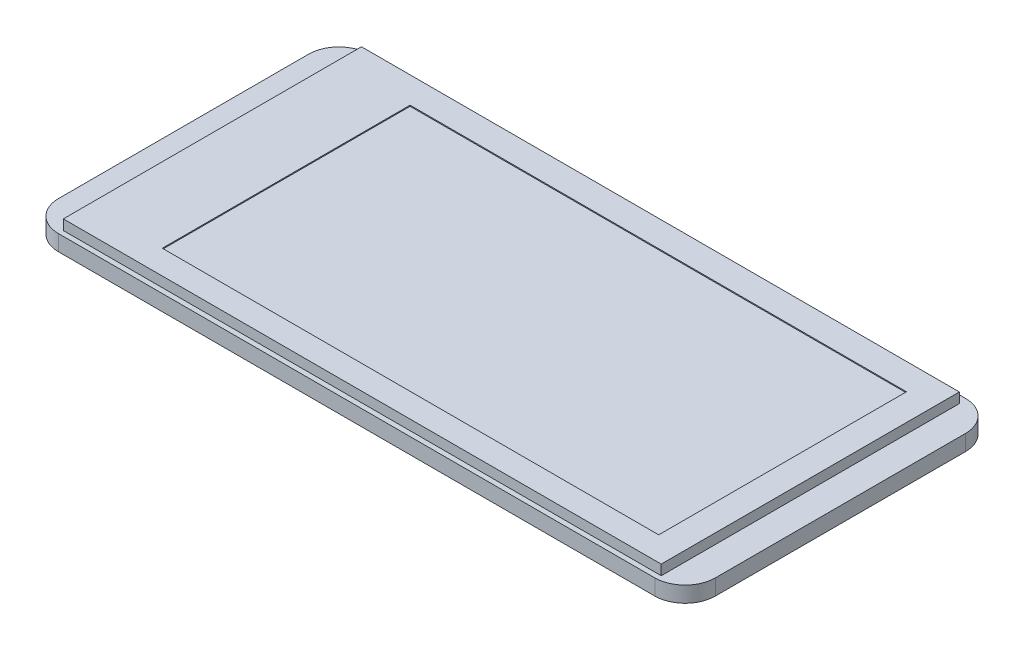
ISO-10303-21;
HEADER;
FILE_DESCRIPTION(('STEP AP214'),'2;1');
FILE_NAME('part.step','',(''),(''),'','','');
FILE_SCHEMA(('AUTOMOTIVE_DESIGN { 1 0 10303 214 1 1 1 1 }'));
ENDSEC;
DATA;
#1=APPLICATION_CONTEXT('core data for automotive mechanical design processes');
#2=APPLICATION_PROTOCOL_DEFINITION('international standard','automotive_design',2000,#1);
#3=PRODUCT_CONTEXT('',#1,'mechanical');
#4=PRODUCT('Part','Part','',(#3));
#5=PRODUCT_RELATED_PRODUCT_CATEGORY('part','',(#4));
#6=PRODUCT_DEFINITION_FORMATION('','',#4);
#7=PRODUCT_DEFINITION_CONTEXT('part definition',#1,'design');
#8=PRODUCT_DEFINITION('design','',#6,#7);
#9=PRODUCT_DEFINITION_SHAPE('','',#8);
#10=(LENGTH_UNIT() NAMED_UNIT(*) SI_UNIT(.MILLI.,.METRE.));
#11=(NAMED_UNIT(*) PLANE_ANGLE_UNIT() SI_UNIT($,.RADIAN.));
#12=(NAMED_UNIT(*) SI_UNIT($,.STERADIAN.) SOLID_ANGLE_UNIT());
#13=UNCERTAINTY_MEASURE_WITH_UNIT(LENGTH_MEASURE(1.E-05),#10,'distance_accuracy_value','');
#14=(GEOMETRIC_REPRESENTATION_CONTEXT(3) GLOBAL_UNCERTAINTY_ASSIGNED_CONTEXT((#13)) GLOBAL_UNIT_ASSIGNED_CONTEXT((#10,
#11,#12)) REPRESENTATION_CONTEXT('',''));
#15=CARTESIAN_POINT('',(0.,0.,0.));
#16=DIRECTION('',(0.,0.,1.));
#17=DIRECTION('',(1.,0.,0.));
#18=AXIS2_PLACEMENT_3D('',#15,#16,#17);
#19=CARTESIAN_POINT('',(-29.5,0.,12.375));
#20=DIRECTION('',(0.,1.,0.));
#21=DIRECTION('',(0.,0.,1.));
#22=AXIS2_PLACEMENT_3D('',#19,#20,#21);
#23=PLANE('',#22);
#24=CARTESIAN_POINT('',(-29.5,0.,12.375));
#25=DIRECTION('',(0.,1.,0.));
#26=DIRECTION('',(0.,0.,1.));
#27=AXIS2_PLACEMENT_3D('',#24,#25,#26);
#28=CIRCLE('',#27,3.);
#29=CARTESIAN_POINT('',(-32.5,0.,12.375));
#30=VERTEX_POINT('',#29);
#31=CARTESIAN_POINT('',(-29.5,0.,15.375));
#32=VERTEX_POINT('',#31);
#33=EDGE_CURVE('E273',#30,#32,#28,.T.);
#34=ORIENTED_EDGE('',*,*,#33,.F.);
#35=DIRECTION('',(0.,0.,1.));
#36=VECTOR('',#35,1.);
#37=CARTESIAN_POINT('',(-32.5,0.,-12.375));
#38=LINE('',#37,#36);
#39=CARTESIAN_POINT('',(-32.5,0.,-12.375));
#40=VERTEX_POINT('',#39);
#41=EDGE_CURVE('E278',#40,#30,#38,.T.);
#42=ORIENTED_EDGE('',*,*,#41,.F.);
#43=CARTESIAN_POINT('',(-29.5,0.,-12.375));
#44=DIRECTION('',(0.,1.,0.));
#45=DIRECTION('',(0.,0.,1.));
#46=AXIS2_PLACEMENT_3D('',#43,#44,#45);
#47=CIRCLE('',#46,3.);
#48=CARTESIAN_POINT('',(-29.5,0.,-15.375));
#49=VERTEX_POINT('',#48);
#50=EDGE_CURVE('E305',#49,#40,#47,.T.);
#51=ORIENTED_EDGE('',*,*,#50,.F.);
#52=DIRECTION('',(-1.,0.,0.));
#53=VECTOR('',#52,1.);
#54=CARTESIAN_POINT('',(-29.5,0.,-15.375));
#55=LINE('',#54,#53);
#56=CARTESIAN_POINT('',(29.5,0.,-15.375));
#57=VERTEX_POINT('',#56);
#58=EDGE_CURVE('E303',#57,#49,#55,.T.);
#59=ORIENTED_EDGE('',*,*,#58,.F.);
#60=CARTESIAN_POINT('',(29.5,0.,-12.375));
#61=DIRECTION('',(0.,1.,0.));
#62=DIRECTION('',(0.,0.,-1.));
#63=AXIS2_PLACEMENT_3D('',#60,#61,#62);
#64=CIRCLE('',#63,3.);
#65=CARTESIAN_POINT('',(32.5,0.,-12.375));
#66=VERTEX_POINT('',#65);
#67=EDGE_CURVE('E301',#66,#57,#64,.T.);
#68=ORIENTED_EDGE('',*,*,#67,.F.);
#69=DIRECTION('',(0.,0.,-1.));
#70=VECTOR('',#69,1.);
#71=CARTESIAN_POINT('',(32.5,0.,-12.375));
#72=LINE('',#71,#70);
#73=CARTESIAN_POINT('',(32.5,0.,12.375));
#74=VERTEX_POINT('',#73);
#75=EDGE_CURVE('E299',#74,#66,#72,.T.);
#76=ORIENTED_EDGE('',*,*,#75,.F.);
#77=CARTESIAN_POINT('',(29.5,0.,12.375));
#78=DIRECTION('',(0.,1.,0.));
#79=DIRECTION('',(0.,0.,1.));
#80=AXIS2_PLACEMENT_3D('',#77,#78,#79);
#81=CIRCLE('',#80,3.);
#82=CARTESIAN_POINT('',(29.5,0.,15.375));
#83=VERTEX_POINT('',#82);
#84=EDGE_CURVE('E297',#83,#74,#81,.T.);
#85=ORIENTED_EDGE('',*,*,#84,.F.);
#86=DIRECTION('',(1.,0.,0.));
#87=VECTOR('',#86,1.);
#88=CARTESIAN_POINT('',(-29.5,0.,15.375));
#89=LINE('',#88,#87);
#90=EDGE_CURVE('E295',#32,#83,#89,.T.);
#91=ORIENTED_EDGE('',*,*,#90,.F.);
#92=EDGE_LOOP('',(#34,#42,#51,#59,#68,#76,#85,#91));
#93=FACE_BOUND('',#92,.T.);
#94=DIRECTION('',(0.,0.,-1.));
#95=VECTOR('',#94,1.);
#96=CARTESIAN_POINT('',(-25.7,0.,-8.735));
#97=LINE('',#96,#95);
#98=CARTESIAN_POINT('',(-25.7,0.,-8.735));
#99=VERTEX_POINT('',#98);
#100=CARTESIAN_POINT('',(-25.7,0.,-13.735));
#101=VERTEX_POINT('',#100);
#102=EDGE_CURVE('E207',#99,#101,#97,.T.);
#103=ORIENTED_EDGE('',*,*,#102,.F.);
#104=DIRECTION('',(-1.,0.,0.));
#105=VECTOR('',#104,1.);
#106=CARTESIAN_POINT('',(-25.7,0.,-8.735));
#107=LINE('',#106,#105);
#108=CARTESIAN_POINT('',(25.3,0.,-8.735));
#109=VERTEX_POINT('',#108);
#110=EDGE_CURVE('E215',#109,#99,#107,.T.);
#111=ORIENTED_EDGE('',*,*,#110,.F.);
#112=DIRECTION('',(0.,0.,1.));
#113=VECTOR('',#112,1.);
#114=CARTESIAN_POINT('',(25.3,0.,-8.735));
#115=LINE('',#114,#113);
#116=CARTESIAN_POINT('',(25.3,0.,-13.735));
#117=VERTEX_POINT('',#116);
#118=EDGE_CURVE('E225',#117,#109,#115,.T.);
#119=ORIENTED_EDGE('',*,*,#118,.F.);
#120=DIRECTION('',(1.,0.,0.));
#121=VECTOR('',#120,1.);
#122=CARTESIAN_POINT('',(-25.7,0.,-13.735));
#123=LINE('',#122,#121);
#124=EDGE_CURVE('E58',#101,#117,#123,.T.);
#125=ORIENTED_EDGE('',*,*,#124,.F.);
#126=EDGE_LOOP('',(#103,#111,#119,#125));
#127=FACE_BOUND('',#126,.T.);
#128=ADVANCED_FACE('F35',(#93,#127),#23,.F.);
#129=CARTESIAN_POINT('',(-29.5,1.56,12.375));
#130=DIRECTION('',(0.,-1.,0.));
#131=DIRECTION('',(0.,0.,-1.));
#132=AXIS2_PLACEMENT_3D('',#129,#130,#131);
#133=CYLINDRICAL_SURFACE('',#132,3.);
#134=ORIENTED_EDGE('',*,*,#33,.T.);
#135=DIRECTION('',(0.,-1.,0.));
#136=VECTOR('',#135,1.);
#137=CARTESIAN_POINT('',(-29.5,1.56,15.375));
#138=LINE('',#137,#136);
#139=CARTESIAN_POINT('',(-29.5,1.56,15.375));
#140=VERTEX_POINT('',#139);
#141=EDGE_CURVE('E11',#140,#32,#138,.T.);
#142=ORIENTED_EDGE('',*,*,#141,.F.);
#143=CARTESIAN_POINT('',(-29.5,1.56,12.375));
#144=DIRECTION('',(0.,1.,0.));
#145=DIRECTION('',(0.,0.,1.));
#146=AXIS2_PLACEMENT_3D('',#143,#144,#145);
#147=CIRCLE('',#146,3.);
#148=CARTESIAN_POINT('',(-32.5,1.56,12.375));
#149=VERTEX_POINT('',#148);
#150=EDGE_CURVE('E274',#149,#140,#147,.T.);
#151=ORIENTED_EDGE('',*,*,#150,.F.);
#152=DIRECTION('',(0.,-1.,0.));
#153=VECTOR('',#152,1.);
#154=CARTESIAN_POINT('',(-32.5,1.56,12.375));
#155=LINE('',#154,#153);
#156=EDGE_CURVE('E292',#149,#30,#155,.T.);
#157=ORIENTED_EDGE('',*,*,#156,.T.);
#158=EDGE_LOOP('',(#134,#142,#151,#157));
#159=FACE_BOUND('',#158,.T.);
#160=ADVANCED_FACE('F37',(#159),#133,.T.);
#161=CARTESIAN_POINT('',(-29.5,1.56,15.375));
#162=DIRECTION('',(0.,0.,-1.));
#163=DIRECTION('',(-1.,0.,0.));
#164=AXIS2_PLACEMENT_3D('',#161,#162,#163);
#165=PLANE('',#164);
#166=ORIENTED_EDGE('',*,*,#90,.T.);
#167=DIRECTION('',(0.,-1.,0.));
#168=VECTOR('',#167,1.);
#169=CARTESIAN_POINT('',(29.5,1.56,15.375));
#170=LINE('',#169,#168);
#171=CARTESIAN_POINT('',(29.5,1.56,15.375));
#172=VERTEX_POINT('',#171);
#173=EDGE_CURVE('E43',#172,#83,#170,.T.);
#174=ORIENTED_EDGE('',*,*,#173,.F.);
#175=DIRECTION('',(1.,0.,0.));
#176=VECTOR('',#175,1.);
#177=CARTESIAN_POINT('',(-29.5,1.56,15.375));
#178=LINE('',#177,#176);
#179=EDGE_CURVE('E277',#140,#172,#178,.T.);
#180=ORIENTED_EDGE('',*,*,#179,.F.);
#181=ORIENTED_EDGE('',*,*,#141,.T.);
#182=EDGE_LOOP('',(#166,#174,#180,#181));
#183=FACE_BOUND('',#182,.T.);
#184=ADVANCED_FACE('F351',(#183),#165,.F.);
#185=CARTESIAN_POINT('',(29.5,1.56,12.375));
#186=DIRECTION('',(0.,-1.,0.));
#187=DIRECTION('',(0.,0.,-1.));
#188=AXIS2_PLACEMENT_3D('',#185,#186,#187);
#189=CYLINDRICAL_SURFACE('',#188,3.);
#190=ORIENTED_EDGE('',*,*,#84,.T.);
#191=DIRECTION('',(0.,-1.,0.));
#192=VECTOR('',#191,1.);
#193=CARTESIAN_POINT('',(32.5,1.56,12.375));
#194=LINE('',#193,#192);
#195=CARTESIAN_POINT('',(32.5,1.56,12.375));
#196=VERTEX_POINT('',#195);
#197=EDGE_CURVE('E322',#196,#74,#194,.T.);
#198=ORIENTED_EDGE('',*,*,#197,.F.);
#199=CARTESIAN_POINT('',(29.5,1.56,12.375));
#200=DIRECTION('',(0.,1.,0.));
#201=DIRECTION('',(0.,0.,1.));
#202=AXIS2_PLACEMENT_3D('',#199,#200,#201);
#203=CIRCLE('',#202,3.);
#204=EDGE_CURVE('E280',#172,#196,#203,.T.);
#205=ORIENTED_EDGE('',*,*,#204,.F.);
#206=ORIENTED_EDGE('',*,*,#173,.T.);
#207=EDGE_LOOP('',(#190,#198,#205,#206));
#208=FACE_BOUND('',#207,.T.);
#209=ADVANCED_FACE('F329',(#208),#189,.T.);
#210=CARTESIAN_POINT('',(32.5,1.56,-12.375));
#211=DIRECTION('',(-1.,0.,0.));
#212=DIRECTION('',(0.,0.,1.));
#213=AXIS2_PLACEMENT_3D('',#210,#211,#212);
#214=PLANE('',#213);
#215=ORIENTED_EDGE('',*,*,#75,.T.);
#216=DIRECTION('',(0.,-1.,0.));
#217=VECTOR('',#216,1.);
#218=CARTESIAN_POINT('',(32.5,1.56,-12.375));
#219=LINE('',#218,#217);
#220=CARTESIAN_POINT('',(32.5,1.56,-12.375));
#221=VERTEX_POINT('',#220);
#222=EDGE_CURVE('E319',#221,#66,#219,.T.);
#223=ORIENTED_EDGE('',*,*,#222,.F.);
#224=DIRECTION('',(0.,0.,-1.));
#225=VECTOR('',#224,1.);
#226=CARTESIAN_POINT('',(32.5,1.56,-12.375));
#227=LINE('',#226,#225);
#228=EDGE_CURVE('E282',#196,#221,#227,.T.);
#229=ORIENTED_EDGE('',*,*,#228,.F.);
#230=ORIENTED_EDGE('',*,*,#197,.T.);
#231=EDGE_LOOP('',(#215,#223,#229,#230));
#232=FACE_BOUND('',#231,.T.);
#233=ADVANCED_FACE('F339',(#232),#214,.F.);
#234=CARTESIAN_POINT('',(29.5,1.56,-12.375));
#235=DIRECTION('',(0.,-1.,0.));
#236=DIRECTION('',(0.,0.,-1.));
#237=AXIS2_PLACEMENT_3D('',#234,#235,#236);
#238=CYLINDRICAL_SURFACE('',#237,3.);
#239=ORIENTED_EDGE('',*,*,#67,.T.);
#240=DIRECTION('',(0.,-1.,0.));
#241=VECTOR('',#240,1.);
#242=CARTESIAN_POINT('',(29.5,1.56,-15.375));
#243=LINE('',#242,#241);
#244=CARTESIAN_POINT('',(29.5,1.56,-15.375));
#245=VERTEX_POINT('',#244);
#246=EDGE_CURVE('E316',#245,#57,#243,.T.);
#247=ORIENTED_EDGE('',*,*,#246,.F.);
#248=CARTESIAN_POINT('',(29.5,1.56,-12.375));
#249=DIRECTION('',(0.,1.,0.));
#250=DIRECTION('',(0.,0.,-1.));
#251=AXIS2_PLACEMENT_3D('',#248,#249,#250);
#252=CIRCLE('',#251,3.);
#253=EDGE_CURVE('E284',#221,#245,#252,.T.);
#254=ORIENTED_EDGE('',*,*,#253,.F.);
#255=ORIENTED_EDGE('',*,*,#222,.T.);
#256=EDGE_LOOP('',(#239,#247,#254,#255));
#257=FACE_BOUND('',#256,.T.);
#258=ADVANCED_FACE('F343',(#257),#238,.T.);
#259=CARTESIAN_POINT('',(-29.5,1.56,-15.375));
#260=DIRECTION('',(0.,0.,1.));
#261=DIRECTION('',(1.,0.,0.));
#262=AXIS2_PLACEMENT_3D('',#259,#260,#261);
#263=PLANE('',#262);
#264=ORIENTED_EDGE('',*,*,#58,.T.);
#265=DIRECTION('',(0.,-1.,0.));
#266=VECTOR('',#265,1.);
#267=CARTESIAN_POINT('',(-29.5,1.56,-15.375));
#268=LINE('',#267,#266);
#269=CARTESIAN_POINT('',(-29.5,1.56,-15.375));
#270=VERTEX_POINT('',#269);
#271=EDGE_CURVE('E313',#270,#49,#268,.T.);
#272=ORIENTED_EDGE('',*,*,#271,.F.);
#273=DIRECTION('',(-1.,0.,0.));
#274=VECTOR('',#273,1.);
#275=CARTESIAN_POINT('',(-29.5,1.56,-15.375));
#276=LINE('',#275,#274);
#277=EDGE_CURVE('E286',#245,#270,#276,.T.);
#278=ORIENTED_EDGE('',*,*,#277,.F.);
#279=ORIENTED_EDGE('',*,*,#246,.T.);
#280=EDGE_LOOP('',(#264,#272,#278,#279));
#281=FACE_BOUND('',#280,.T.);
#282=ADVANCED_FACE('F364',(#281),#263,.F.);
#283=CARTESIAN_POINT('',(-29.5,1.56,-12.375));
#284=DIRECTION('',(0.,-1.,0.));
#285=DIRECTION('',(0.,0.,-1.));
#286=AXIS2_PLACEMENT_3D('',#283,#284,#285);
#287=CYLINDRICAL_SURFACE('',#286,3.);
#288=ORIENTED_EDGE('',*,*,#50,.T.);
#289=DIRECTION('',(0.,-1.,0.));
#290=VECTOR('',#289,1.);
#291=CARTESIAN_POINT('',(-32.5,1.56,-12.375));
#292=LINE('',#291,#290);
#293=CARTESIAN_POINT('',(-32.5,1.56,-12.375));
#294=VERTEX_POINT('',#293);
#295=EDGE_CURVE('E310',#294,#40,#292,.T.);
#296=ORIENTED_EDGE('',*,*,#295,.F.);
#297=CARTESIAN_POINT('',(-29.5,1.56,-12.375));
#298=DIRECTION('',(0.,1.,0.));
#299=DIRECTION('',(0.,0.,1.));
#300=AXIS2_PLACEMENT_3D('',#297,#298,#299);
#301=CIRCLE('',#300,3.);
#302=EDGE_CURVE('E288',#270,#294,#301,.T.);
#303=ORIENTED_EDGE('',*,*,#302,.F.);
#304=ORIENTED_EDGE('',*,*,#271,.T.);
#305=EDGE_LOOP('',(#288,#296,#303,#304));
#306=FACE_BOUND('',#305,.T.);
#307=ADVANCED_FACE('F362',(#306),#287,.T.);
#308=CARTESIAN_POINT('',(-32.5,1.56,-12.375));
#309=DIRECTION('',(1.,0.,0.));
#310=DIRECTION('',(0.,0.,-1.));
#311=AXIS2_PLACEMENT_3D('',#308,#309,#310);
#312=PLANE('',#311);
#313=ORIENTED_EDGE('',*,*,#41,.T.);
#314=ORIENTED_EDGE('',*,*,#156,.F.);
#315=DIRECTION('',(0.,0.,1.));
#316=VECTOR('',#315,1.);
#317=CARTESIAN_POINT('',(-32.5,1.56,-12.375));
#318=LINE('',#317,#316);
#319=EDGE_CURVE('E290',#294,#149,#318,.T.);
#320=ORIENTED_EDGE('',*,*,#319,.F.);
#321=ORIENTED_EDGE('',*,*,#295,.T.);
#322=EDGE_LOOP('',(#313,#314,#320,#321));
#323=FACE_BOUND('',#322,.T.);
#324=ADVANCED_FACE('F357',(#323),#312,.F.);
#325=CARTESIAN_POINT('',(-29.5,1.56,12.375));
#326=DIRECTION('',(0.,1.,0.));
#327=DIRECTION('',(0.,0.,1.));
#328=AXIS2_PLACEMENT_3D('',#325,#326,#327);
#329=PLANE('',#328);
#330=DIRECTION('',(0.,0.,1.));
#331=VECTOR('',#330,1.);
#332=CARTESIAN_POINT('',(-29.52,1.56,-14.625));
#333=LINE('',#332,#331);
#334=CARTESIAN_POINT('',(-29.52,1.56,-14.625));
#335=VERTEX_POINT('',#334);
#336=CARTESIAN_POINT('',(-29.52,1.56,14.875));
#337=VERTEX_POINT('',#336);
#338=EDGE_CURVE('E240',#335,#337,#333,.T.);
#339=ORIENTED_EDGE('',*,*,#338,.F.);
#340=DIRECTION('',(-1.,0.,0.));
#341=VECTOR('',#340,1.);
#342=CARTESIAN_POINT('',(-29.52,1.56,-14.625));
#343=LINE('',#342,#341);
#344=CARTESIAN_POINT('',(29.64,1.56,-14.625));
#345=VERTEX_POINT('',#344);
#346=EDGE_CURVE('E245',#345,#335,#343,.T.);
#347=ORIENTED_EDGE('',*,*,#346,.F.);
#348=DIRECTION('',(0.,0.,-1.));
#349=VECTOR('',#348,1.);
#350=CARTESIAN_POINT('',(29.64,1.56,-14.625));
#351=LINE('',#350,#349);
#352=CARTESIAN_POINT('',(29.64,1.56,14.875));
#353=VERTEX_POINT('',#352);
#354=EDGE_CURVE('E257',#353,#345,#351,.T.);
#355=ORIENTED_EDGE('',*,*,#354,.F.);
#356=DIRECTION('',(1.,0.,0.));
#357=VECTOR('',#356,1.);
#358=CARTESIAN_POINT('',(-29.52,1.56,14.875));
#359=LINE('',#358,#357);
#360=EDGE_CURVE('E254',#337,#353,#359,.T.);
#361=ORIENTED_EDGE('',*,*,#360,.F.);
#362=EDGE_LOOP('',(#339,#347,#355,#361));
#363=FACE_BOUND('',#362,.T.);
#364=ORIENTED_EDGE('',*,*,#150,.T.);
#365=ORIENTED_EDGE('',*,*,#179,.T.);
#366=ORIENTED_EDGE('',*,*,#204,.T.);
#367=ORIENTED_EDGE('',*,*,#228,.T.);
#368=ORIENTED_EDGE('',*,*,#253,.T.);
#369=ORIENTED_EDGE('',*,*,#277,.T.);
#370=ORIENTED_EDGE('',*,*,#302,.T.);
#371=ORIENTED_EDGE('',*,*,#319,.T.);
#372=EDGE_LOOP('',(#364,#365,#366,#367,#368,#369,#370,#371));
#373=FACE_BOUND('',#372,.T.);
#374=ADVANCED_FACE('F347',(#363,#373),#329,.T.);
#375=CARTESIAN_POINT('',(-29.52,2.56,-14.625));
#376=DIRECTION('',(1.,0.,0.));
#377=DIRECTION('',(0.,0.,-1.));
#378=AXIS2_PLACEMENT_3D('',#375,#376,#377);
#379=PLANE('',#378);
#380=ORIENTED_EDGE('',*,*,#338,.T.);
#381=DIRECTION('',(0.,-1.,0.));
#382=VECTOR('',#381,1.);
#383=CARTESIAN_POINT('',(-29.52,2.56,14.875));
#384=LINE('',#383,#382);
#385=CARTESIAN_POINT('',(-29.52,2.56,14.875));
#386=VERTEX_POINT('',#385);
#387=EDGE_CURVE('E270',#386,#337,#384,.T.);
#388=ORIENTED_EDGE('',*,*,#387,.F.);
#389=DIRECTION('',(0.,0.,1.));
#390=VECTOR('',#389,1.);
#391=CARTESIAN_POINT('',(-29.52,2.56,-14.625));
#392=LINE('',#391,#390);
#393=CARTESIAN_POINT('',(-29.52,2.56,-14.625));
#394=VERTEX_POINT('',#393);
#395=EDGE_CURVE('E241',#394,#386,#392,.T.);
#396=ORIENTED_EDGE('',*,*,#395,.F.);
#397=DIRECTION('',(0.,-1.,0.));
#398=VECTOR('',#397,1.);
#399=CARTESIAN_POINT('',(-29.52,2.56,-14.625));
#400=LINE('',#399,#398);
#401=EDGE_CURVE('E251',#394,#335,#400,.T.);
#402=ORIENTED_EDGE('',*,*,#401,.T.);
#403=EDGE_LOOP('',(#380,#388,#396,#402));
#404=FACE_BOUND('',#403,.T.);
#405=ADVANCED_FACE('F385',(#404),#379,.F.);
#406=CARTESIAN_POINT('',(-29.52,2.56,14.875));
#407=DIRECTION('',(0.,0.,-1.));
#408=DIRECTION('',(-1.,0.,0.));
#409=AXIS2_PLACEMENT_3D('',#406,#407,#408);
#410=PLANE('',#409);
#411=ORIENTED_EDGE('',*,*,#360,.T.);
#412=DIRECTION('',(0.,-1.,0.));
#413=VECTOR('',#412,1.);
#414=CARTESIAN_POINT('',(29.64,2.56,14.875));
#415=LINE('',#414,#413);
#416=CARTESIAN_POINT('',(29.64,2.56,14.875));
#417=VERTEX_POINT('',#416);
#418=EDGE_CURVE('E267',#417,#353,#415,.T.);
#419=ORIENTED_EDGE('',*,*,#418,.F.);
#420=DIRECTION('',(1.,0.,0.));
#421=VECTOR('',#420,1.);
#422=CARTESIAN_POINT('',(-29.52,2.56,14.875));
#423=LINE('',#422,#421);
#424=EDGE_CURVE('E244',#386,#417,#423,.T.);
#425=ORIENTED_EDGE('',*,*,#424,.F.);
#426=ORIENTED_EDGE('',*,*,#387,.T.);
#427=EDGE_LOOP('',(#411,#419,#425,#426));
#428=FACE_BOUND('',#427,.T.);
#429=ADVANCED_FACE('F390',(#428),#410,.F.);
#430=CARTESIAN_POINT('',(29.64,2.56,-14.625));
#431=DIRECTION('',(-1.,0.,0.));
#432=DIRECTION('',(0.,0.,1.));
#433=AXIS2_PLACEMENT_3D('',#430,#431,#432);
#434=PLANE('',#433);
#435=ORIENTED_EDGE('',*,*,#354,.T.);
#436=DIRECTION('',(0.,-1.,0.));
#437=VECTOR('',#436,1.);
#438=CARTESIAN_POINT('',(29.64,2.56,-14.625));
#439=LINE('',#438,#437);
#440=CARTESIAN_POINT('',(29.64,2.56,-14.625));
#441=VERTEX_POINT('',#440);
#442=EDGE_CURVE('E264',#441,#345,#439,.T.);
#443=ORIENTED_EDGE('',*,*,#442,.F.);
#444=DIRECTION('',(0.,0.,-1.));
#445=VECTOR('',#444,1.);
#446=CARTESIAN_POINT('',(29.64,2.56,-14.625));
#447=LINE('',#446,#445);
#448=EDGE_CURVE('E247',#417,#441,#447,.T.);
#449=ORIENTED_EDGE('',*,*,#448,.F.);
#450=ORIENTED_EDGE('',*,*,#418,.T.);
#451=EDGE_LOOP('',(#435,#443,#449,#450));
#452=FACE_BOUND('',#451,.T.);
#453=ADVANCED_FACE('F404',(#452),#434,.F.);
#454=CARTESIAN_POINT('',(-29.52,2.56,-14.625));
#455=DIRECTION('',(0.,0.,1.));
#456=DIRECTION('',(1.,0.,0.));
#457=AXIS2_PLACEMENT_3D('',#454,#455,#456);
#458=PLANE('',#457);
#459=ORIENTED_EDGE('',*,*,#346,.T.);
#460=ORIENTED_EDGE('',*,*,#401,.F.);
#461=DIRECTION('',(-1.,0.,0.));
#462=VECTOR('',#461,1.);
#463=CARTESIAN_POINT('',(-29.52,2.56,-14.625));
#464=LINE('',#463,#462);
#465=EDGE_CURVE('E249',#441,#394,#464,.T.);
#466=ORIENTED_EDGE('',*,*,#465,.F.);
#467=ORIENTED_EDGE('',*,*,#442,.T.);
#468=EDGE_LOOP('',(#459,#460,#466,#467));
#469=FACE_BOUND('',#468,.T.);
#470=ADVANCED_FACE('F395',(#469),#458,.F.);
#471=CARTESIAN_POINT('',(0.,2.56,0.));
#472=DIRECTION('',(0.,1.,0.));
#473=DIRECTION('',(0.,0.,1.));
#474=AXIS2_PLACEMENT_3D('',#471,#472,#473);
#475=PLANE('',#474);
#476=DIRECTION('',(0.,0.,1.));
#477=VECTOR('',#476,1.);
#478=CARTESIAN_POINT('',(-22.11,2.56,-12.025));
#479=LINE('',#478,#477);
#480=CARTESIAN_POINT('',(-22.11,2.56,-12.025));
#481=VERTEX_POINT('',#480);
#482=CARTESIAN_POINT('',(-22.11,2.56,12.495));
#483=VERTEX_POINT('',#482);
#484=EDGE_CURVE('E50',#481,#483,#479,.T.);
#485=ORIENTED_EDGE('',*,*,#484,.F.);
#486=DIRECTION('',(-1.,0.,0.));
#487=VECTOR('',#486,1.);
#488=CARTESIAN_POINT('',(-22.11,2.56,-12.025));
#489=LINE('',#488,#487);
#490=CARTESIAN_POINT('',(27.01,2.56,-12.025));
#491=VERTEX_POINT('',#490);
#492=EDGE_CURVE('E192',#491,#481,#489,.T.);
#493=ORIENTED_EDGE('',*,*,#492,.F.);
#494=DIRECTION('',(0.,0.,-1.));
#495=VECTOR('',#494,1.);
#496=CARTESIAN_POINT('',(27.01,2.56,-12.025));
#497=LINE('',#496,#495);
#498=CARTESIAN_POINT('',(27.01,2.56,12.495));
#499=VERTEX_POINT('',#498);
#500=EDGE_CURVE('E195',#499,#491,#497,.T.);
#501=ORIENTED_EDGE('',*,*,#500,.F.);
#502=DIRECTION('',(1.,0.,0.));
#503=VECTOR('',#502,1.);
#504=CARTESIAN_POINT('',(-22.11,2.56,12.495));
#505=LINE('',#504,#503);
#506=EDGE_CURVE('E201',#483,#499,#505,.T.);
#507=ORIENTED_EDGE('',*,*,#506,.F.);
#508=EDGE_LOOP('',(#485,#493,#501,#507));
#509=FACE_BOUND('',#508,.T.);
#510=ORIENTED_EDGE('',*,*,#395,.T.);
#511=ORIENTED_EDGE('',*,*,#424,.T.);
#512=ORIENTED_EDGE('',*,*,#448,.T.);
#513=ORIENTED_EDGE('',*,*,#465,.T.);
#514=EDGE_LOOP('',(#510,#511,#512,#513));
#515=FACE_BOUND('',#514,.T.);
#516=ADVANCED_FACE('F400',(#509,#515),#475,.T.);
#517=CARTESIAN_POINT('',(-25.7,-3.68,-8.735));
#518=DIRECTION('',(1.,0.,0.));
#519=DIRECTION('',(0.,0.,-1.));
#520=AXIS2_PLACEMENT_3D('',#517,#518,#519);
#521=PLANE('',#520);
#522=ORIENTED_EDGE('',*,*,#102,.T.);
#523=DIRECTION('',(0.,1.,0.));
#524=VECTOR('',#523,1.);
#525=CARTESIAN_POINT('',(-25.7,-3.68,-13.735));
#526=LINE('',#525,#524);
#527=CARTESIAN_POINT('',(-25.7,-3.68,-13.735));
#528=VERTEX_POINT('',#527);
#529=EDGE_CURVE('E238',#528,#101,#526,.T.);
#530=ORIENTED_EDGE('',*,*,#529,.F.);
#531=DIRECTION('',(0.,0.,-1.));
#532=VECTOR('',#531,1.);
#533=CARTESIAN_POINT('',(-25.7,-3.68,-8.735));
#534=LINE('',#533,#532);
#535=CARTESIAN_POINT('',(-25.7,-3.68,-8.735));
#536=VERTEX_POINT('',#535);
#537=EDGE_CURVE('E211',#536,#528,#534,.T.);
#538=ORIENTED_EDGE('',*,*,#537,.F.);
#539=DIRECTION('',(0.,1.,0.));
#540=VECTOR('',#539,1.);
#541=CARTESIAN_POINT('',(-25.7,-3.68,-8.735));
#542=LINE('',#541,#540);
#543=EDGE_CURVE('E221',#536,#99,#542,.T.);
#544=ORIENTED_EDGE('',*,*,#543,.T.);
#545=EDGE_LOOP('',(#522,#530,#538,#544));
#546=FACE_BOUND('',#545,.T.);
#547=ADVANCED_FACE('F417',(#546),#521,.F.);
#548=CARTESIAN_POINT('',(-25.7,-3.68,-13.735));
#549=DIRECTION('',(0.,0.,1.));
#550=DIRECTION('',(1.,0.,0.));
#551=AXIS2_PLACEMENT_3D('',#548,#549,#550);
#552=PLANE('',#551);
#553=ORIENTED_EDGE('',*,*,#124,.T.);
#554=DIRECTION('',(0.,1.,0.));
#555=VECTOR('',#554,1.);
#556=CARTESIAN_POINT('',(25.3,-3.68,-13.735));
#557=LINE('',#556,#555);
#558=CARTESIAN_POINT('',(25.3,-3.68,-13.735));
#559=VERTEX_POINT('',#558);
#560=EDGE_CURVE('E235',#559,#117,#557,.T.);
#561=ORIENTED_EDGE('',*,*,#560,.F.);
#562=DIRECTION('',(1.,0.,0.));
#563=VECTOR('',#562,1.);
#564=CARTESIAN_POINT('',(-25.7,-3.68,-13.735));
#565=LINE('',#564,#563);
#566=EDGE_CURVE('E214',#528,#559,#565,.T.);
#567=ORIENTED_EDGE('',*,*,#566,.F.);
#568=ORIENTED_EDGE('',*,*,#529,.T.);
#569=EDGE_LOOP('',(#553,#561,#567,#568));
#570=FACE_BOUND('',#569,.T.);
#571=ADVANCED_FACE('F421',(#570),#552,.F.);
#572=CARTESIAN_POINT('',(25.3,-3.68,-8.735));
#573=DIRECTION('',(-1.,0.,0.));
#574=DIRECTION('',(0.,0.,1.));
#575=AXIS2_PLACEMENT_3D('',#572,#573,#574);
#576=PLANE('',#575);
#577=ORIENTED_EDGE('',*,*,#118,.T.);
#578=DIRECTION('',(0.,1.,0.));
#579=VECTOR('',#578,1.);
#580=CARTESIAN_POINT('',(25.3,-3.68,-8.735));
#581=LINE('',#580,#579);
#582=CARTESIAN_POINT('',(25.3,-3.68,-8.735));
#583=VERTEX_POINT('',#582);
#584=EDGE_CURVE('E232',#583,#109,#581,.T.);
#585=ORIENTED_EDGE('',*,*,#584,.F.);
#586=DIRECTION('',(0.,0.,1.));
#587=VECTOR('',#586,1.);
#588=CARTESIAN_POINT('',(25.3,-3.68,-8.735));
#589=LINE('',#588,#587);
#590=EDGE_CURVE('E217',#559,#583,#589,.T.);
#591=ORIENTED_EDGE('',*,*,#590,.F.);
#592=ORIENTED_EDGE('',*,*,#560,.T.);
#593=EDGE_LOOP('',(#577,#585,#591,#592));
#594=FACE_BOUND('',#593,.T.);
#595=ADVANCED_FACE('F425',(#594),#576,.F.);
#596=CARTESIAN_POINT('',(-25.7,-3.68,-8.735));
#597=DIRECTION('',(0.,0.,-1.));
#598=DIRECTION('',(-1.,0.,0.));
#599=AXIS2_PLACEMENT_3D('',#596,#597,#598);
#600=PLANE('',#599);
#601=ORIENTED_EDGE('',*,*,#110,.T.);
#602=ORIENTED_EDGE('',*,*,#543,.F.);
#603=DIRECTION('',(-1.,0.,0.));
#604=VECTOR('',#603,1.);
#605=CARTESIAN_POINT('',(-25.7,-3.68,-8.735));
#606=LINE('',#605,#604);
#607=EDGE_CURVE('E219',#583,#536,#606,.T.);
#608=ORIENTED_EDGE('',*,*,#607,.F.);
#609=ORIENTED_EDGE('',*,*,#584,.T.);
#610=EDGE_LOOP('',(#601,#602,#608,#609));
#611=FACE_BOUND('',#610,.T.);
#612=ADVANCED_FACE('F429',(#611),#600,.F.);
#613=CARTESIAN_POINT('',(0.,-3.68,0.));
#614=DIRECTION('',(0.,-1.,0.));
#615=DIRECTION('',(0.,0.,-1.));
#616=AXIS2_PLACEMENT_3D('',#613,#614,#615);
#617=PLANE('',#616);
#618=ORIENTED_EDGE('',*,*,#537,.T.);
#619=ORIENTED_EDGE('',*,*,#566,.T.);
#620=ORIENTED_EDGE('',*,*,#590,.T.);
#621=ORIENTED_EDGE('',*,*,#607,.T.);
#622=EDGE_LOOP('',(#618,#619,#620,#621));
#623=FACE_BOUND('',#622,.T.);
#624=ADVANCED_FACE('F433',(#623),#617,.T.);
#625=CARTESIAN_POINT('',(-22.11,2.46,-12.025));
#626=DIRECTION('',(-1.,0.,0.));
#627=DIRECTION('',(0.,0.,1.));
#628=AXIS2_PLACEMENT_3D('',#625,#626,#627);
#629=PLANE('',#628);
#630=ORIENTED_EDGE('',*,*,#484,.T.);
#631=DIRECTION('',(0.,1.,0.));
#632=VECTOR('',#631,1.);
#633=CARTESIAN_POINT('',(-22.11,2.46,12.495));
#634=LINE('',#633,#632);
#635=CARTESIAN_POINT('',(-22.11,2.46,12.495));
#636=VERTEX_POINT('',#635);
#637=EDGE_CURVE('E170',#636,#483,#634,.T.);
#638=ORIENTED_EDGE('',*,*,#637,.F.);
#639=DIRECTION('',(0.,0.,1.));
#640=VECTOR('',#639,1.);
#641=CARTESIAN_POINT('',(-22.11,2.46,-12.025));
#642=LINE('',#641,#640);
#643=CARTESIAN_POINT('',(-22.11,2.46,-12.025));
#644=VERTEX_POINT('',#643);
#645=EDGE_CURVE('E174',#644,#636,#642,.T.);
#646=ORIENTED_EDGE('',*,*,#645,.F.);
#647=DIRECTION('',(0.,1.,0.));
#648=VECTOR('',#647,1.);
#649=CARTESIAN_POINT('',(-22.11,2.46,-12.025));
#650=LINE('',#649,#648);
#651=EDGE_CURVE('E205',#644,#481,#650,.T.);
#652=ORIENTED_EDGE('',*,*,#651,.T.);
#653=EDGE_LOOP('',(#630,#638,#646,#652));
#654=FACE_BOUND('',#653,.T.);
#655=ADVANCED_FACE('F172',(#654),#629,.F.);
#656=CARTESIAN_POINT('',(-22.11,2.46,-12.025));
#657=DIRECTION('',(0.,0.,-1.));
#658=DIRECTION('',(-1.,0.,0.));
#659=AXIS2_PLACEMENT_3D('',#656,#657,#658);
#660=PLANE('',#659);
#661=ORIENTED_EDGE('',*,*,#492,.T.);
#662=ORIENTED_EDGE('',*,*,#651,.F.);
#663=DIRECTION('',(-1.,0.,0.));
#664=VECTOR('',#663,1.);
#665=CARTESIAN_POINT('',(-22.11,2.46,-12.025));
#666=LINE('',#665,#664);
#667=CARTESIAN_POINT('',(27.01,2.46,-12.025));
#668=VERTEX_POINT('',#667);
#669=EDGE_CURVE('E180',#668,#644,#666,.T.);
#670=ORIENTED_EDGE('',*,*,#669,.F.);
#671=DIRECTION('',(0.,1.,0.));
#672=VECTOR('',#671,1.);
#673=CARTESIAN_POINT('',(27.01,2.46,-12.025));
#674=LINE('',#673,#672);
#675=EDGE_CURVE('E208',#668,#491,#674,.T.);
#676=ORIENTED_EDGE('',*,*,#675,.T.);
#677=EDGE_LOOP('',(#661,#662,#670,#676));
#678=FACE_BOUND('',#677,.T.);
#679=ADVANCED_FACE('F440',(#678),#660,.F.);
#680=CARTESIAN_POINT('',(27.01,2.46,-12.025));
#681=DIRECTION('',(1.,0.,0.));
#682=DIRECTION('',(0.,0.,-1.));
#683=AXIS2_PLACEMENT_3D('',#680,#681,#682);
#684=PLANE('',#683);
#685=ORIENTED_EDGE('',*,*,#500,.T.);
#686=ORIENTED_EDGE('',*,*,#675,.F.);
#687=DIRECTION('',(0.,0.,-1.));
#688=VECTOR('',#687,1.);
#689=CARTESIAN_POINT('',(27.01,2.46,-12.025));
#690=LINE('',#689,#688);
#691=CARTESIAN_POINT('',(27.01,2.46,12.495));
#692=VERTEX_POINT('',#691);
#693=EDGE_CURVE('E188',#692,#668,#690,.T.);
#694=ORIENTED_EDGE('',*,*,#693,.F.);
#695=DIRECTION('',(0.,1.,0.));
#696=VECTOR('',#695,1.);
#697=CARTESIAN_POINT('',(27.01,2.46,12.495));
#698=LINE('',#697,#696);
#699=EDGE_CURVE('E179',#692,#499,#698,.T.);
#700=ORIENTED_EDGE('',*,*,#699,.T.);
#701=EDGE_LOOP('',(#685,#686,#694,#700));
#702=FACE_BOUND('',#701,.T.);
#703=ADVANCED_FACE('F443',(#702),#684,.F.);
#704=CARTESIAN_POINT('',(-22.11,2.46,12.495));
#705=DIRECTION('',(0.,0.,1.));
#706=DIRECTION('',(1.,0.,0.));
#707=AXIS2_PLACEMENT_3D('',#704,#705,#706);
#708=PLANE('',#707);
#709=ORIENTED_EDGE('',*,*,#506,.T.);
#710=ORIENTED_EDGE('',*,*,#699,.F.);
#711=DIRECTION('',(1.,0.,0.));
#712=VECTOR('',#711,1.);
#713=CARTESIAN_POINT('',(-22.11,2.46,12.495));
#714=LINE('',#713,#712);
#715=EDGE_CURVE('E183',#636,#692,#714,.T.);
#716=ORIENTED_EDGE('',*,*,#715,.F.);
#717=ORIENTED_EDGE('',*,*,#637,.T.);
#718=EDGE_LOOP('',(#709,#710,#716,#717));
#719=FACE_BOUND('',#718,.T.);
#720=ADVANCED_FACE('F184',(#719),#708,.F.);
#721=CARTESIAN_POINT('',(0.,2.46,0.));
#722=DIRECTION('',(0.,1.,0.));
#723=DIRECTION('',(0.,0.,1.));
#724=AXIS2_PLACEMENT_3D('',#721,#722,#723);
#725=PLANE('',#724);
#726=ORIENTED_EDGE('',*,*,#645,.T.);
#727=ORIENTED_EDGE('',*,*,#715,.T.);
#728=ORIENTED_EDGE('',*,*,#693,.T.);
#729=ORIENTED_EDGE('',*,*,#669,.T.);
#730=EDGE_LOOP('',(#726,#727,#728,#729));
#731=FACE_BOUND('',#730,.T.);
#732=ADVANCED_FACE('F190',(#731),#725,.T.);
#733=CLOSED_SHELL('',(#128,#160,#184,#209,#233,#258,#282,#307,#324,#374,#405,#429,#453,#470,
#516,#547,#571,#595,#612,#624,#655,#679,#703,#720,#732));
#734=MANIFOLD_SOLID_BREP('B2',#733);
#735=ADVANCED_BREP_SHAPE_REPRESENTATION('',(#18,#734),#14);
#736=SHAPE_DEFINITION_REPRESENTATION(#9,#735);
ENDSEC;
END-ISO-10303-21;
